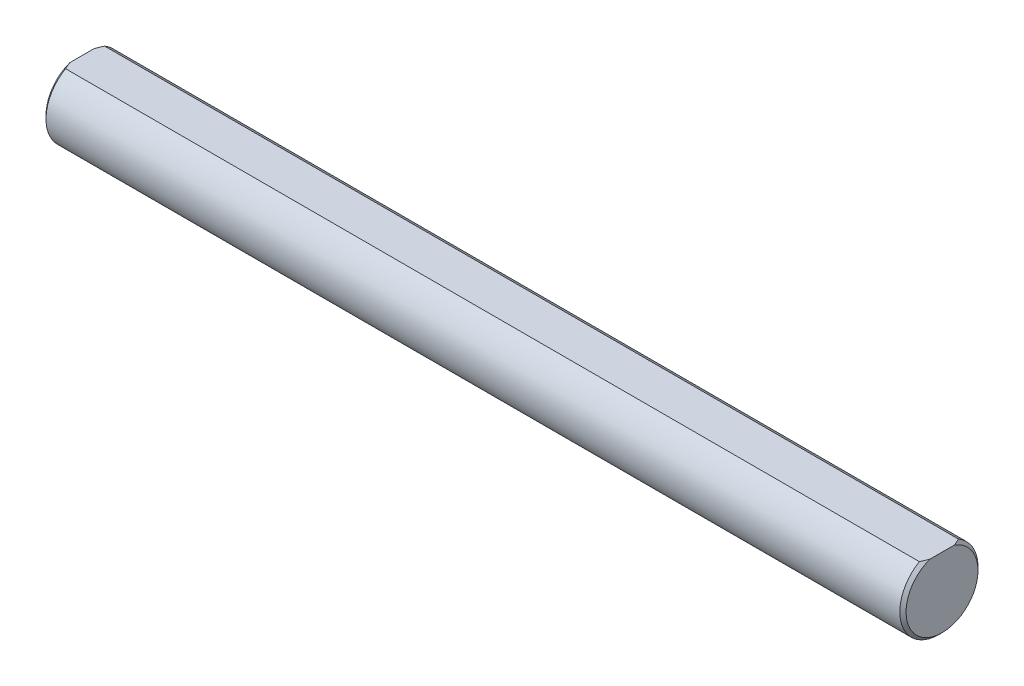
ISO-10303-21;
HEADER;
FILE_DESCRIPTION(('STEP AP214'),'2;1');
FILE_NAME('part.step','',(''),(''),'','','');
FILE_SCHEMA(('AUTOMOTIVE_DESIGN { 1 0 10303 214 1 1 1 1 }'));
ENDSEC;
DATA;
#1=APPLICATION_CONTEXT('core data for automotive mechanical design processes');
#2=APPLICATION_PROTOCOL_DEFINITION('international standard','automotive_design',2000,#1);
#3=PRODUCT_CONTEXT('',#1,'mechanical');
#4=PRODUCT('Part','Part','',(#3));
#5=PRODUCT_RELATED_PRODUCT_CATEGORY('part','',(#4));
#6=PRODUCT_DEFINITION_FORMATION('','',#4);
#7=PRODUCT_DEFINITION_CONTEXT('part definition',#1,'design');
#8=PRODUCT_DEFINITION('design','',#6,#7);
#9=PRODUCT_DEFINITION_SHAPE('','',#8);
#10=(LENGTH_UNIT() NAMED_UNIT(*) SI_UNIT(.MILLI.,.METRE.));
#11=(NAMED_UNIT(*) PLANE_ANGLE_UNIT() SI_UNIT($,.RADIAN.));
#12=(NAMED_UNIT(*) SI_UNIT($,.STERADIAN.) SOLID_ANGLE_UNIT());
#13=UNCERTAINTY_MEASURE_WITH_UNIT(LENGTH_MEASURE(1.E-05),#10,'distance_accuracy_value','');
#14=(GEOMETRIC_REPRESENTATION_CONTEXT(3) GLOBAL_UNCERTAINTY_ASSIGNED_CONTEXT((#13)) GLOBAL_UNIT_ASSIGNED_CONTEXT((#10,
#11,#12)) REPRESENTATION_CONTEXT('',''));
#15=CARTESIAN_POINT('',(0.,0.,0.));
#16=DIRECTION('',(0.,0.,1.));
#17=DIRECTION('',(1.,0.,0.));
#18=AXIS2_PLACEMENT_3D('',#15,#16,#17);
#19=CARTESIAN_POINT('',(69.85,0.,0.));
#20=DIRECTION('',(-1.,0.,0.));
#21=DIRECTION('',(0.,0.,1.));
#22=AXIS2_PLACEMENT_3D('',#19,#20,#21);
#23=CYLINDRICAL_SURFACE('',#22,3.175);
#24=CARTESIAN_POINT('',(69.596,0.,0.));
#25=DIRECTION('',(1.,0.,0.));
#26=DIRECTION('',(0.,0.,-1.));
#27=AXIS2_PLACEMENT_3D('',#24,#25,#26);
#28=CIRCLE('',#27,3.175);
#29=CARTESIAN_POINT('',(69.596,2.74963065701559,-1.5875));
#30=VERTEX_POINT('',#29);
#31=CARTESIAN_POINT('',(69.596,2.74963065701559,1.5875));
#32=VERTEX_POINT('',#31);
#33=EDGE_CURVE('E111',#30,#32,#28,.F.);
#34=ORIENTED_EDGE('',*,*,#33,.T.);
#35=DIRECTION('',(1.,0.,0.));
#36=VECTOR('',#35,1.);
#37=CARTESIAN_POINT('',(0.,2.74963065701559,1.5875));
#38=LINE('',#37,#36);
#39=CARTESIAN_POINT('',(0.254000000000004,2.74963065701559,1.5875));
#40=VERTEX_POINT('',#39);
#41=EDGE_CURVE('E107',#40,#32,#38,.T.);
#42=ORIENTED_EDGE('',*,*,#41,.F.);
#43=CARTESIAN_POINT('',(0.254000000000004,0.,0.));
#44=DIRECTION('',(1.,0.,0.));
#45=DIRECTION('',(0.,0.,-1.));
#46=AXIS2_PLACEMENT_3D('',#43,#44,#45);
#47=CIRCLE('',#46,3.175);
#48=CARTESIAN_POINT('',(0.254000000000004,2.74963065701559,-1.5875));
#49=VERTEX_POINT('',#48);
#50=EDGE_CURVE('E115',#40,#49,#47,.T.);
#51=ORIENTED_EDGE('',*,*,#50,.T.);
#52=DIRECTION('',(1.,0.,0.));
#53=VECTOR('',#52,1.);
#54=CARTESIAN_POINT('',(0.,2.74963065701559,-1.5875));
#55=LINE('',#54,#53);
#56=EDGE_CURVE('E97',#49,#30,#55,.T.);
#57=ORIENTED_EDGE('',*,*,#56,.T.);
#58=EDGE_LOOP('',(#34,#42,#51,#57));
#59=FACE_BOUND('',#58,.T.);
#60=ADVANCED_FACE('F51',(#59),#23,.T.);
#61=CARTESIAN_POINT('',(69.85,0.,0.));
#62=DIRECTION('',(1.,0.,0.));
#63=DIRECTION('',(0.,0.,-1.));
#64=AXIS2_PLACEMENT_3D('',#61,#62,#63);
#65=PLANE('',#64);
#66=DIRECTION('',(0.,0.,-1.));
#67=VECTOR('',#66,1.);
#68=CARTESIAN_POINT('',(69.85,2.74963065701559,1.5875));
#69=LINE('',#68,#67);
#70=CARTESIAN_POINT('',(69.85,2.74963065701559,0.985785093212492));
#71=VERTEX_POINT('',#70);
#72=CARTESIAN_POINT('',(69.85,2.74963065701559,-0.985785093212492));
#73=VERTEX_POINT('',#72);
#74=EDGE_CURVE('E108',#71,#73,#69,.T.);
#75=ORIENTED_EDGE('',*,*,#74,.F.);
#76=CARTESIAN_POINT('',(69.85,0.,0.));
#77=DIRECTION('',(1.,0.,0.));
#78=DIRECTION('',(0.,0.,-1.));
#79=AXIS2_PLACEMENT_3D('',#76,#77,#78);
#80=CIRCLE('',#79,2.92099999999999);
#81=EDGE_CURVE('E120',#71,#73,#80,.T.);
#82=ORIENTED_EDGE('',*,*,#81,.T.);
#83=EDGE_LOOP('',(#75,#82));
#84=FACE_BOUND('',#83,.T.);
#85=ADVANCED_FACE('F139',(#84),#65,.T.);
#86=CARTESIAN_POINT('',(0.,0.,0.));
#87=DIRECTION('',(1.,0.,0.));
#88=DIRECTION('',(0.,0.,-1.));
#89=AXIS2_PLACEMENT_3D('',#86,#87,#88);
#90=PLANE('',#89);
#91=CARTESIAN_POINT('',(0.,0.,0.));
#92=DIRECTION('',(1.,0.,0.));
#93=DIRECTION('',(0.,0.,-1.));
#94=AXIS2_PLACEMENT_3D('',#91,#92,#93);
#95=CIRCLE('',#94,2.92099999999999);
#96=CARTESIAN_POINT('',(0.,2.74963065701559,-0.985785093212473));
#97=VERTEX_POINT('',#96);
#98=CARTESIAN_POINT('',(0.,2.74963065701559,0.985785093212473));
#99=VERTEX_POINT('',#98);
#100=EDGE_CURVE('E105',#97,#99,#95,.F.);
#101=ORIENTED_EDGE('',*,*,#100,.T.);
#102=DIRECTION('',(0.,0.,-1.));
#103=VECTOR('',#102,1.);
#104=CARTESIAN_POINT('',(0.,2.74963065701559,1.5875));
#105=LINE('',#104,#103);
#106=EDGE_CURVE('E73',#99,#97,#105,.T.);
#107=ORIENTED_EDGE('',*,*,#106,.T.);
#108=EDGE_LOOP('',(#101,#107));
#109=FACE_BOUND('',#108,.T.);
#110=ADVANCED_FACE('F104',(#109),#90,.F.);
#111=CARTESIAN_POINT('',(69.85,0.,0.));
#112=DIRECTION('',(-1.,0.,0.));
#113=DIRECTION('',(0.,0.,1.));
#114=AXIS2_PLACEMENT_3D('',#111,#112,#113);
#115=CONICAL_SURFACE('',#114,2.92099999999999,0.785398163397453);
#116=CARTESIAN_POINT('',(69.5956499421324,2.74963065701559,1.5882));
#117=CARTESIAN_POINT('',(69.6501996989638,2.74963065701559,1.47903148983545));
#118=CARTESIAN_POINT('',(69.7015467736488,2.74963065701559,1.36803725312432));
#119=CARTESIAN_POINT('',(69.7955640164844,2.74963065701559,1.14170613856963));
#120=CARTESIAN_POINT('',(69.8381818395588,2.74963065701559,1.02634771127007));
#121=CARTESIAN_POINT('',(69.911188105863,2.74963065701559,0.793732645811723));
#122=CARTESIAN_POINT('',(69.9417601474436,2.74963065701559,0.676535314799123));
#123=CARTESIAN_POINT('',(69.988863762629,2.74963065701559,0.439559207905001));
#124=CARTESIAN_POINT('',(70.0054305251547,2.74963065701559,0.319787681762662));
#125=CARTESIAN_POINT('',(70.0203772767312,2.74963065701559,0.113390763403369));
#126=CARTESIAN_POINT('',(70.0225911723138,2.74963065701559,0.0270323810887405));
#127=CARTESIAN_POINT('',(70.0188706827955,2.74963065701559,-0.145543469555235));
#128=CARTESIAN_POINT('',(70.0129334400268,2.74963065701559,-0.231760877849898));
#129=CARTESIAN_POINT('',(69.993248527632,2.74963065701559,-0.403381872739646));
#130=CARTESIAN_POINT('',(69.9794921121183,2.74963065701559,-0.488784438972697));
#131=CARTESIAN_POINT('',(69.9449240312318,2.74963065701559,-0.658112847485177));
#132=CARTESIAN_POINT('',(69.9241129063332,2.74963065701559,-0.74203880237254));
#133=CARTESIAN_POINT('',(69.86230417238,2.74963065701559,-0.95709705257587));
#134=CARTESIAN_POINT('',(69.8166386107286,2.74963065701559,-1.08689353852331));
#135=CARTESIAN_POINT('',(69.739545010794,2.74963065701559,-1.27774543186104));
#136=CARTESIAN_POINT('',(69.712457262408,2.74963065701559,-1.34063930357724));
#137=CARTESIAN_POINT('',(69.6558118782309,2.74963065701559,-1.4652612196074));
#138=CARTESIAN_POINT('',(69.6262557633007,2.74963065701559,-1.52698995347895));
#139=CARTESIAN_POINT('',(69.5956499421324,2.74963065701559,-1.5882));
#140=B_SPLINE_CURVE_WITH_KNOTS('',3,(#116,#117,#118,#119,#120,#121,#122,#123,#124,#125,#126,
#127,#128,#129,#130,#131,#132,#133,#134,#135,#136,#137,#138,#139),.UNSPECIFIED.,.F.,.F.,(4,2,2,
2,2,2,2,2,2,2,2,4),(0.,0.366369811138814,0.734876090737492,1.09752564771281,1.45926129943165,
1.7180547703144,1.97693899350527,2.23611335485406,2.49526786486626,2.90718803562744,
3.11259006926564,3.31786646708283),.UNSPECIFIED.);
#141=EDGE_CURVE('E124',#32,#71,#140,.T.);
#142=ORIENTED_EDGE('',*,*,#141,.F.);
#143=ORIENTED_EDGE('',*,*,#33,.F.);
#144=EDGE_CURVE('E80',#73,#30,#140,.T.);
#145=ORIENTED_EDGE('',*,*,#144,.F.);
#146=ORIENTED_EDGE('',*,*,#81,.F.);
#147=EDGE_LOOP('',(#142,#143,#145,#146));
#148=FACE_BOUND('',#147,.T.);
#149=ADVANCED_FACE('F133',(#148),#115,.T.);
#150=CARTESIAN_POINT('',(0.254000000000004,0.,0.));
#151=DIRECTION('',(1.,0.,0.));
#152=DIRECTION('',(0.,0.,-1.));
#153=AXIS2_PLACEMENT_3D('',#150,#151,#152);
#154=CONICAL_SURFACE('',#153,3.175,0.785398163397466);
#155=CARTESIAN_POINT('',(0.25435005786764,2.74963065701559,-1.5882));
#156=CARTESIAN_POINT('',(0.199800301036174,2.74963065701559,-1.47903148983545));
#157=CARTESIAN_POINT('',(0.148453226351238,2.74963065701559,-1.36803725312432));
#158=CARTESIAN_POINT('',(0.0544359835155501,2.74963065701559,-1.14170613856962));
#159=CARTESIAN_POINT('',(0.0118181604412333,2.74963065701559,-1.02634771127007));
#160=CARTESIAN_POINT('',(-0.0611881058630191,2.74963065701559,-0.793732645811711));
#161=CARTESIAN_POINT('',(-0.0917601474436372,2.74963065701559,-0.676535314799108));
#162=CARTESIAN_POINT('',(-0.138863762628945,2.74963065701559,-0.439559207904981));
#163=CARTESIAN_POINT('',(-0.15543052515468,2.74963065701559,-0.319787681762638));
#164=CARTESIAN_POINT('',(-0.1703772767312,2.74963065701559,-0.113390763403339));
#165=CARTESIAN_POINT('',(-0.172591172313827,2.74963065701559,-0.0270323810887076));
#166=CARTESIAN_POINT('',(-0.168870682795467,2.74963065701559,0.145543469555275));
#167=CARTESIAN_POINT('',(-0.162933440026808,2.74963065701559,0.23176087784994));
#168=CARTESIAN_POINT('',(-0.143248527631959,2.74963065701559,0.403381872739695));
#169=CARTESIAN_POINT('',(-0.129492112118329,2.74963065701559,0.488784438972748));
#170=CARTESIAN_POINT('',(-0.0949240312318378,2.74963065701559,0.658112847485232));
#171=CARTESIAN_POINT('',(-0.0741129063331795,2.74963065701559,0.742038802372597));
#172=CARTESIAN_POINT('',(-0.0123041723800064,2.74963065701559,0.957097052575918));
#173=CARTESIAN_POINT('',(0.0333613892713875,2.74963065701559,1.08689353852335));
#174=CARTESIAN_POINT('',(0.110454989206037,2.74963065701559,1.27774543186107));
#175=CARTESIAN_POINT('',(0.137542737592027,2.74963065701559,1.34063930357726));
#176=CARTESIAN_POINT('',(0.194188121769104,2.74963065701559,1.46526121960741));
#177=CARTESIAN_POINT('',(0.223744236699292,2.74963065701559,1.52698995347896));
#178=CARTESIAN_POINT('',(0.25435005786764,2.74963065701559,1.5882));
#179=B_SPLINE_CURVE_WITH_KNOTS('',3,(#155,#156,#157,#158,#159,#160,#161,#162,#163,#164,#165,
#166,#167,#168,#169,#170,#171,#172,#173,#174,#175,#176,#177,#178),.UNSPECIFIED.,.F.,.F.,(4,2,2,
2,2,2,2,2,2,2,2,4),(0.,0.366369811138819,0.734876090737503,1.09752564771282,1.45926129943167,
1.71805477031443,1.97693899350531,2.23611335485411,2.49526786486632,2.90718803562747,
3.11259006926565,3.31786646708283),.UNSPECIFIED.);
#180=EDGE_CURVE('E11',#49,#97,#179,.T.);
#181=ORIENTED_EDGE('',*,*,#180,.F.);
#182=ORIENTED_EDGE('',*,*,#50,.F.);
#183=EDGE_CURVE('E57',#99,#40,#179,.T.);
#184=ORIENTED_EDGE('',*,*,#183,.F.);
#185=ORIENTED_EDGE('',*,*,#100,.F.);
#186=EDGE_LOOP('',(#181,#182,#184,#185));
#187=FACE_BOUND('',#186,.T.);
#188=ADVANCED_FACE('F54',(#187),#154,.T.);
#189=CARTESIAN_POINT('',(0.,2.74963065701559,1.5875));
#190=DIRECTION('',(0.,-1.,0.));
#191=DIRECTION('',(0.,0.,-1.));
#192=AXIS2_PLACEMENT_3D('',#189,#190,#191);
#193=PLANE('',#192);
#194=ORIENTED_EDGE('',*,*,#141,.T.);
#195=ORIENTED_EDGE('',*,*,#74,.T.);
#196=ORIENTED_EDGE('',*,*,#144,.T.);
#197=ORIENTED_EDGE('',*,*,#56,.F.);
#198=ORIENTED_EDGE('',*,*,#180,.T.);
#199=ORIENTED_EDGE('',*,*,#106,.F.);
#200=ORIENTED_EDGE('',*,*,#183,.T.);
#201=ORIENTED_EDGE('',*,*,#41,.T.);
#202=EDGE_LOOP('',(#194,#195,#196,#197,#198,#199,#200,#201));
#203=FACE_BOUND('',#202,.T.);
#204=ADVANCED_FACE('F96',(#203),#193,.F.);
#205=CLOSED_SHELL('',(#60,#85,#110,#149,#188,#204));
#206=MANIFOLD_SOLID_BREP('B2',#205);
#207=ADVANCED_BREP_SHAPE_REPRESENTATION('',(#18,#206),#14);
#208=SHAPE_DEFINITION_REPRESENTATION(#9,#207);
ENDSEC;
END-ISO-10303-21;
